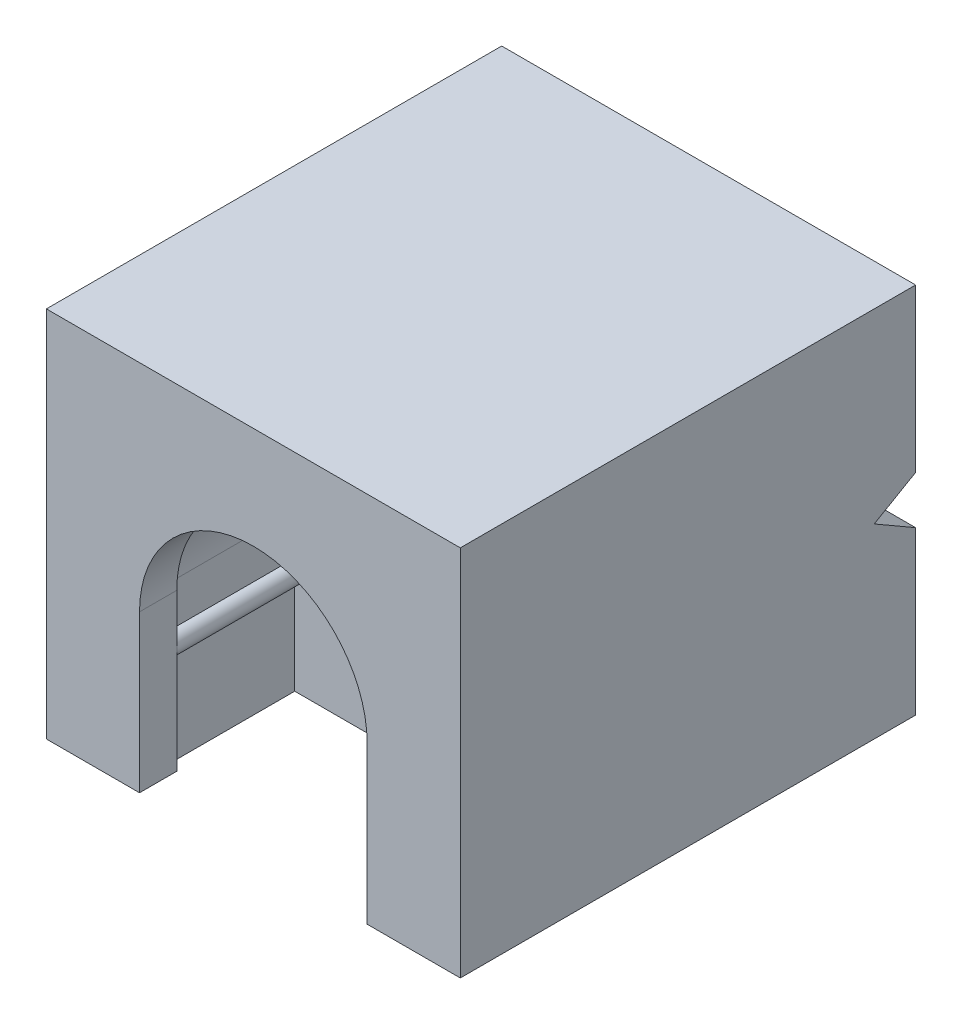
ISO-10303-21;
HEADER;
FILE_DESCRIPTION(('STEP AP214'),'2;1');
FILE_NAME('part.step','',(''),(''),'','','');
FILE_SCHEMA(('AUTOMOTIVE_DESIGN { 1 0 10303 214 1 1 1 1 }'));
ENDSEC;
DATA;
#1=APPLICATION_CONTEXT('core data for automotive mechanical design processes');
#2=APPLICATION_PROTOCOL_DEFINITION('international standard','automotive_design',2000,#1);
#3=PRODUCT_CONTEXT('',#1,'mechanical');
#4=PRODUCT('Part','Part','',(#3));
#5=PRODUCT_RELATED_PRODUCT_CATEGORY('part','',(#4));
#6=PRODUCT_DEFINITION_FORMATION('','',#4);
#7=PRODUCT_DEFINITION_CONTEXT('part definition',#1,'design');
#8=PRODUCT_DEFINITION('design','',#6,#7);
#9=PRODUCT_DEFINITION_SHAPE('','',#8);
#10=(LENGTH_UNIT() NAMED_UNIT(*) SI_UNIT(.MILLI.,.METRE.));
#11=(NAMED_UNIT(*) PLANE_ANGLE_UNIT() SI_UNIT($,.RADIAN.));
#12=(NAMED_UNIT(*) SI_UNIT($,.STERADIAN.) SOLID_ANGLE_UNIT());
#13=UNCERTAINTY_MEASURE_WITH_UNIT(LENGTH_MEASURE(1.E-05),#10,'distance_accuracy_value','');
#14=(GEOMETRIC_REPRESENTATION_CONTEXT(3) GLOBAL_UNCERTAINTY_ASSIGNED_CONTEXT((#13)) GLOBAL_UNIT_ASSIGNED_CONTEXT((#10,
#11,#12)) REPRESENTATION_CONTEXT('',''));
#15=CARTESIAN_POINT('',(0.,0.,0.));
#16=DIRECTION('',(0.,0.,1.));
#17=DIRECTION('',(1.,0.,0.));
#18=AXIS2_PLACEMENT_3D('',#15,#16,#17);
#19=CARTESIAN_POINT('',(-3.,-1.24999581003196,4.));
#20=DIRECTION('',(0.,0.,-1.));
#21=DIRECTION('',(-1.,0.,0.));
#22=AXIS2_PLACEMENT_3D('',#19,#20,#21);
#23=CYLINDRICAL_SURFACE('',#22,0.25);
#24=CARTESIAN_POINT('',(-3.,-1.24999581003196,2.85));
#25=DIRECTION('',(-0.707106781186554,0.,0.707106781186541));
#26=DIRECTION('',(-0.707106781186541,0.,-0.707106781186554));
#27=AXIS2_PLACEMENT_3D('',#24,#25,#26);
#28=ELLIPSE('',#27,0.353553390593277,0.25);
#29=CARTESIAN_POINT('',(-2.85,-1.04999581003196,3.));
#30=VERTEX_POINT('',#29);
#31=CARTESIAN_POINT('',(-2.75,-1.24999581003196,3.1));
#32=VERTEX_POINT('',#31);
#33=EDGE_CURVE('E118',#30,#32,#28,.F.);
#34=ORIENTED_EDGE('',*,*,#33,.T.);
#35=CARTESIAN_POINT('',(-3.,-1.24999581003196,2.85));
#36=DIRECTION('',(-0.707106781186554,0.,0.707106781186541));
#37=DIRECTION('',(-0.707106781186541,0.,-0.707106781186554));
#38=AXIS2_PLACEMENT_3D('',#35,#36,#37);
#39=ELLIPSE('',#38,0.353553390593277,0.25);
#40=CARTESIAN_POINT('',(-2.85,-1.44999581003196,3.));
#41=VERTEX_POINT('',#40);
#42=EDGE_CURVE('E12',#32,#41,#39,.F.);
#43=ORIENTED_EDGE('',*,*,#42,.T.);
#44=CARTESIAN_POINT('',(-3.,-1.24999581003196,3.));
#45=DIRECTION('',(0.,0.,1.));
#46=DIRECTION('',(1.,0.,0.));
#47=AXIS2_PLACEMENT_3D('',#44,#45,#46);
#48=CIRCLE('',#47,0.25);
#49=CARTESIAN_POINT('',(-3.,-1.49999581003196,3.));
#50=VERTEX_POINT('',#49);
#51=EDGE_CURVE('E482',#50,#41,#48,.T.);
#52=ORIENTED_EDGE('',*,*,#51,.F.);
#53=DIRECTION('',(0.,0.,-1.));
#54=VECTOR('',#53,1.);
#55=CARTESIAN_POINT('',(-3.,-1.49999581003196,4.));
#56=LINE('',#55,#54);
#57=CARTESIAN_POINT('',(-3.,-1.49999581003196,0.));
#58=VERTEX_POINT('',#57);
#59=EDGE_CURVE('E411',#50,#58,#56,.T.);
#60=ORIENTED_EDGE('',*,*,#59,.T.);
#61=CARTESIAN_POINT('',(-3.,-1.24999581003196,0.));
#62=DIRECTION('',(0.,0.,1.));
#63=DIRECTION('',(1.,0.,0.));
#64=AXIS2_PLACEMENT_3D('',#61,#62,#63);
#65=CIRCLE('',#64,0.25);
#66=CARTESIAN_POINT('',(-3.,-0.999995810031962,0.));
#67=VERTEX_POINT('',#66);
#68=EDGE_CURVE('E398',#67,#58,#65,.F.);
#69=ORIENTED_EDGE('',*,*,#68,.F.);
#70=DIRECTION('',(0.,0.,-1.));
#71=VECTOR('',#70,1.);
#72=CARTESIAN_POINT('',(-3.,-0.999995810031962,4.));
#73=LINE('',#72,#71);
#74=CARTESIAN_POINT('',(-3.,-0.999995810031962,3.));
#75=VERTEX_POINT('',#74);
#76=EDGE_CURVE('E409',#75,#67,#73,.T.);
#77=ORIENTED_EDGE('',*,*,#76,.F.);
#78=CARTESIAN_POINT('',(-3.,-1.24999581003196,3.));
#79=DIRECTION('',(0.,0.,1.));
#80=DIRECTION('',(1.,0.,0.));
#81=AXIS2_PLACEMENT_3D('',#78,#79,#80);
#82=CIRCLE('',#81,0.25);
#83=EDGE_CURVE('E325',#30,#75,#82,.T.);
#84=ORIENTED_EDGE('',*,*,#83,.F.);
#85=EDGE_LOOP('',(#34,#43,#52,#60,#69,#77,#84));
#86=FACE_BOUND('',#85,.T.);
#87=ADVANCED_FACE('F109',(#86),#23,.T.);
#88=CARTESIAN_POINT('',(-3.,0.,4.));
#89=DIRECTION('',(1.,0.,0.));
#90=DIRECTION('',(0.,0.,-1.));
#91=AXIS2_PLACEMENT_3D('',#88,#89,#90);
#92=PLANE('',#91);
#93=ORIENTED_EDGE('',*,*,#59,.F.);
#94=DIRECTION('',(0.,1.,0.));
#95=VECTOR('',#94,1.);
#96=CARTESIAN_POINT('',(-3.,0.,3.));
#97=LINE('',#96,#95);
#98=CARTESIAN_POINT('',(-3.,-3.78606083848625,3.));
#99=VERTEX_POINT('',#98);
#100=EDGE_CURVE('E298',#99,#50,#97,.T.);
#101=ORIENTED_EDGE('',*,*,#100,.F.);
#102=DIRECTION('',(0.,0.,-1.));
#103=VECTOR('',#102,1.);
#104=CARTESIAN_POINT('',(-3.,-3.78606083848625,4.));
#105=LINE('',#104,#103);
#106=CARTESIAN_POINT('',(-3.,-3.78606083848625,0.));
#107=VERTEX_POINT('',#106);
#108=EDGE_CURVE('E413',#99,#107,#105,.T.);
#109=ORIENTED_EDGE('',*,*,#108,.T.);
#110=DIRECTION('',(0.,-1.,0.));
#111=VECTOR('',#110,1.);
#112=CARTESIAN_POINT('',(-3.,0.,0.));
#113=LINE('',#112,#111);
#114=EDGE_CURVE('E395',#58,#107,#113,.T.);
#115=ORIENTED_EDGE('',*,*,#114,.F.);
#116=EDGE_LOOP('',(#93,#101,#109,#115));
#117=FACE_BOUND('',#116,.T.);
#118=ADVANCED_FACE('F514',(#117),#92,.T.);
#119=CARTESIAN_POINT('',(3.,-1.24999581003196,4.));
#120=DIRECTION('',(0.,0.,-1.));
#121=DIRECTION('',(-1.,0.,0.));
#122=AXIS2_PLACEMENT_3D('',#119,#120,#121);
#123=CYLINDRICAL_SURFACE('',#122,0.25);
#124=CARTESIAN_POINT('',(3.,-1.24999581003196,2.85000000000001));
#125=DIRECTION('',(-0.707106781186541,0.,-0.707106781186554));
#126=DIRECTION('',(0.707106781186554,0.,-0.707106781186541));
#127=AXIS2_PLACEMENT_3D('',#124,#125,#126);
#128=ELLIPSE('',#127,0.353553390593271,0.25);
#129=CARTESIAN_POINT('',(2.85,-1.44999581003196,3.));
#130=VERTEX_POINT('',#129);
#131=CARTESIAN_POINT('',(2.75,-1.24999581003196,3.1));
#132=VERTEX_POINT('',#131);
#133=EDGE_CURVE('E461',#130,#132,#128,.T.);
#134=ORIENTED_EDGE('',*,*,#133,.T.);
#135=CARTESIAN_POINT('',(3.,-1.24999581003196,2.85));
#136=DIRECTION('',(-0.707106781186554,0.,-0.707106781186541));
#137=DIRECTION('',(0.707106781186541,0.,-0.707106781186554));
#138=AXIS2_PLACEMENT_3D('',#135,#136,#137);
#139=ELLIPSE('',#138,0.353553390593277,0.25);
#140=CARTESIAN_POINT('',(2.85,-1.04999581003196,3.));
#141=VERTEX_POINT('',#140);
#142=EDGE_CURVE('E464',#132,#141,#139,.T.);
#143=ORIENTED_EDGE('',*,*,#142,.T.);
#144=CARTESIAN_POINT('',(3.,-1.24999581003196,3.));
#145=DIRECTION('',(0.,0.,1.));
#146=DIRECTION('',(1.,0.,0.));
#147=AXIS2_PLACEMENT_3D('',#144,#145,#146);
#148=CIRCLE('',#147,0.25);
#149=CARTESIAN_POINT('',(3.,-0.999995810031962,3.));
#150=VERTEX_POINT('',#149);
#151=EDGE_CURVE('E330',#150,#141,#148,.T.);
#152=ORIENTED_EDGE('',*,*,#151,.F.);
#153=DIRECTION('',(0.,0.,-1.));
#154=VECTOR('',#153,1.);
#155=CARTESIAN_POINT('',(3.,-0.999995810031962,4.));
#156=LINE('',#155,#154);
#157=CARTESIAN_POINT('',(3.,-0.999995810031962,0.));
#158=VERTEX_POINT('',#157);
#159=EDGE_CURVE('E428',#150,#158,#156,.T.);
#160=ORIENTED_EDGE('',*,*,#159,.T.);
#161=CARTESIAN_POINT('',(3.,-1.24999581003196,0.));
#162=DIRECTION('',(0.,0.,1.));
#163=DIRECTION('',(1.,0.,0.));
#164=AXIS2_PLACEMENT_3D('',#161,#162,#163);
#165=CIRCLE('',#164,0.25);
#166=CARTESIAN_POINT('',(3.,-1.49999581003196,0.));
#167=VERTEX_POINT('',#166);
#168=EDGE_CURVE('E389',#158,#167,#165,.T.);
#169=ORIENTED_EDGE('',*,*,#168,.T.);
#170=DIRECTION('',(0.,0.,-1.));
#171=VECTOR('',#170,1.);
#172=CARTESIAN_POINT('',(3.,-1.49999581003196,4.));
#173=LINE('',#172,#171);
#174=CARTESIAN_POINT('',(3.,-1.49999581003196,3.));
#175=VERTEX_POINT('',#174);
#176=EDGE_CURVE('E426',#175,#167,#173,.T.);
#177=ORIENTED_EDGE('',*,*,#176,.F.);
#178=CARTESIAN_POINT('',(3.,-1.24999581003196,3.));
#179=DIRECTION('',(0.,0.,1.));
#180=DIRECTION('',(1.,0.,0.));
#181=AXIS2_PLACEMENT_3D('',#178,#179,#180);
#182=CIRCLE('',#181,0.25);
#183=EDGE_CURVE('E322',#130,#175,#182,.T.);
#184=ORIENTED_EDGE('',*,*,#183,.F.);
#185=EDGE_LOOP('',(#134,#143,#152,#160,#169,#177,#184));
#186=FACE_BOUND('',#185,.T.);
#187=ADVANCED_FACE('F583',(#186),#123,.T.);
#188=CARTESIAN_POINT('',(3.,0.,4.));
#189=DIRECTION('',(1.,0.,0.));
#190=DIRECTION('',(0.,0.,-1.));
#191=AXIS2_PLACEMENT_3D('',#188,#189,#190);
#192=PLANE('',#191);
#193=DIRECTION('',(0.,-1.,0.));
#194=VECTOR('',#193,1.);
#195=CARTESIAN_POINT('',(3.,0.,3.));
#196=LINE('',#195,#194);
#197=CARTESIAN_POINT('',(3.,-3.78606083848625,3.));
#198=VERTEX_POINT('',#197);
#199=EDGE_CURVE('E317',#175,#198,#196,.T.);
#200=ORIENTED_EDGE('',*,*,#199,.F.);
#201=ORIENTED_EDGE('',*,*,#176,.T.);
#202=DIRECTION('',(0.,-1.,0.));
#203=VECTOR('',#202,1.);
#204=CARTESIAN_POINT('',(3.,0.,0.));
#205=LINE('',#204,#203);
#206=CARTESIAN_POINT('',(3.,-3.78606083848625,0.));
#207=VERTEX_POINT('',#206);
#208=EDGE_CURVE('E392',#167,#207,#205,.T.);
#209=ORIENTED_EDGE('',*,*,#208,.T.);
#210=DIRECTION('',(0.,0.,-1.));
#211=VECTOR('',#210,1.);
#212=CARTESIAN_POINT('',(3.,-3.78606083848625,4.));
#213=LINE('',#212,#211);
#214=EDGE_CURVE('E424',#198,#207,#213,.T.);
#215=ORIENTED_EDGE('',*,*,#214,.F.);
#216=EDGE_LOOP('',(#200,#201,#209,#215));
#217=FACE_BOUND('',#216,.T.);
#218=ADVANCED_FACE('F630',(#217),#192,.F.);
#219=CARTESIAN_POINT('',(3.,0.,4.));
#220=DIRECTION('',(-1.,0.,0.));
#221=DIRECTION('',(0.,-1.,0.));
#222=AXIS2_PLACEMENT_3D('',#219,#220,#221);
#223=PLANE('',#222);
#224=ORIENTED_EDGE('',*,*,#159,.F.);
#225=DIRECTION('',(0.,-1.,0.));
#226=VECTOR('',#225,1.);
#227=CARTESIAN_POINT('',(3.,0.,3.));
#228=LINE('',#227,#226);
#229=CARTESIAN_POINT('',(3.,0.,3.));
#230=VERTEX_POINT('',#229);
#231=EDGE_CURVE('E491',#230,#150,#228,.T.);
#232=ORIENTED_EDGE('',*,*,#231,.F.);
#233=DIRECTION('',(0.,0.,-1.));
#234=VECTOR('',#233,1.);
#235=CARTESIAN_POINT('',(3.,0.,4.));
#236=LINE('',#235,#234);
#237=CARTESIAN_POINT('',(3.,0.,0.));
#238=VERTEX_POINT('',#237);
#239=EDGE_CURVE('E311',#230,#238,#236,.T.);
#240=ORIENTED_EDGE('',*,*,#239,.T.);
#241=DIRECTION('',(0.,1.,0.));
#242=VECTOR('',#241,1.);
#243=CARTESIAN_POINT('',(3.,0.,0.));
#244=LINE('',#243,#242);
#245=EDGE_CURVE('E375',#158,#238,#244,.T.);
#246=ORIENTED_EDGE('',*,*,#245,.F.);
#247=EDGE_LOOP('',(#224,#232,#240,#246));
#248=FACE_BOUND('',#247,.T.);
#249=ADVANCED_FACE('F605',(#248),#223,.T.);
#250=CARTESIAN_POINT('',(-3.,0.,4.));
#251=DIRECTION('',(-1.,0.,0.));
#252=DIRECTION('',(0.,-1.,0.));
#253=AXIS2_PLACEMENT_3D('',#250,#251,#252);
#254=PLANE('',#253);
#255=DIRECTION('',(0.,1.,0.));
#256=VECTOR('',#255,1.);
#257=CARTESIAN_POINT('',(-3.,0.,3.));
#258=LINE('',#257,#256);
#259=CARTESIAN_POINT('',(-3.,0.,3.));
#260=VERTEX_POINT('',#259);
#261=EDGE_CURVE('E494',#75,#260,#258,.T.);
#262=ORIENTED_EDGE('',*,*,#261,.F.);
#263=ORIENTED_EDGE('',*,*,#76,.T.);
#264=DIRECTION('',(0.,1.,0.));
#265=VECTOR('',#264,1.);
#266=CARTESIAN_POINT('',(-3.,0.,0.));
#267=LINE('',#266,#265);
#268=CARTESIAN_POINT('',(-3.,0.,0.));
#269=VERTEX_POINT('',#268);
#270=EDGE_CURVE('E401',#67,#269,#267,.T.);
#271=ORIENTED_EDGE('',*,*,#270,.T.);
#272=DIRECTION('',(0.,0.,-1.));
#273=VECTOR('',#272,1.);
#274=CARTESIAN_POINT('',(-3.,0.,4.));
#275=LINE('',#274,#273);
#276=EDGE_CURVE('E407',#260,#269,#275,.T.);
#277=ORIENTED_EDGE('',*,*,#276,.F.);
#278=EDGE_LOOP('',(#262,#263,#271,#277));
#279=FACE_BOUND('',#278,.T.);
#280=ADVANCED_FACE('F505',(#279),#254,.F.);
#281=CARTESIAN_POINT('',(0.,0.,4.));
#282=DIRECTION('',(0.,0.,-1.));
#283=DIRECTION('',(-1.,0.,0.));
#284=AXIS2_PLACEMENT_3D('',#281,#282,#283);
#285=CYLINDRICAL_SURFACE('',#284,3.);
#286=ORIENTED_EDGE('',*,*,#239,.F.);
#287=CARTESIAN_POINT('',(0.,0.,3.));
#288=DIRECTION('',(0.,0.,1.));
#289=DIRECTION('',(1.,0.,0.));
#290=AXIS2_PLACEMENT_3D('',#287,#288,#289);
#291=CIRCLE('',#290,3.);
#292=EDGE_CURVE('E493',#260,#230,#291,.F.);
#293=ORIENTED_EDGE('',*,*,#292,.F.);
#294=ORIENTED_EDGE('',*,*,#276,.T.);
#295=CARTESIAN_POINT('',(0.,0.,0.));
#296=DIRECTION('',(0.,0.,1.));
#297=DIRECTION('',(1.,0.,0.));
#298=AXIS2_PLACEMENT_3D('',#295,#296,#297);
#299=CIRCLE('',#298,3.);
#300=EDGE_CURVE('E381',#238,#269,#299,.T.);
#301=ORIENTED_EDGE('',*,*,#300,.F.);
#302=EDGE_LOOP('',(#286,#293,#294,#301));
#303=FACE_BOUND('',#302,.T.);
#304=ADVANCED_FACE('F598',(#303),#285,.F.);
#305=CARTESIAN_POINT('',(0.,0.,-7.));
#306=DIRECTION('',(0.,0.,-1.));
#307=DIRECTION('',(-1.,0.,0.));
#308=AXIS2_PLACEMENT_3D('',#305,#306,#307);
#309=PLANE('',#308);
#310=DIRECTION('',(1.,0.,0.));
#311=VECTOR('',#310,1.);
#312=CARTESIAN_POINT('',(0.,1.29128943070337,-7.));
#313=LINE('',#312,#311);
#314=CARTESIAN_POINT('',(-5.,1.29128943070337,-7.));
#315=VERTEX_POINT('',#314);
#316=CARTESIAN_POINT('',(-0.47871355387817,1.29128943070337,-7.));
#317=VERTEX_POINT('',#316);
#318=EDGE_CURVE('E352',#315,#317,#313,.T.);
#319=ORIENTED_EDGE('',*,*,#318,.F.);
#320=DIRECTION('',(0.,-1.,0.));
#321=VECTOR('',#320,1.);
#322=CARTESIAN_POINT('',(-5.,5.21393916151375,-7.));
#323=LINE('',#322,#321);
#324=CARTESIAN_POINT('',(-5.,5.21393916151375,-7.));
#325=VERTEX_POINT('',#324);
#326=EDGE_CURVE('E369',#325,#315,#323,.T.);
#327=ORIENTED_EDGE('',*,*,#326,.F.);
#328=DIRECTION('',(-1.,0.,0.));
#329=VECTOR('',#328,1.);
#330=CARTESIAN_POINT('',(5.,5.21393916151375,-7.));
#331=LINE('',#330,#329);
#332=CARTESIAN_POINT('',(5.,5.21393916151375,-7.));
#333=VERTEX_POINT('',#332);
#334=EDGE_CURVE('E364',#333,#325,#331,.T.);
#335=ORIENTED_EDGE('',*,*,#334,.F.);
#336=DIRECTION('',(0.,1.,0.));
#337=VECTOR('',#336,1.);
#338=CARTESIAN_POINT('',(5.,5.21393916151375,-7.));
#339=LINE('',#338,#337);
#340=CARTESIAN_POINT('',(5.,1.29128943070337,-7.));
#341=VERTEX_POINT('',#340);
#342=EDGE_CURVE('E365',#341,#333,#339,.T.);
#343=ORIENTED_EDGE('',*,*,#342,.F.);
#344=CARTESIAN_POINT('',(0.478713553878169,1.29128943070337,-7.));
#345=VERTEX_POINT('',#344);
#346=EDGE_CURVE('E350',#345,#341,#313,.T.);
#347=ORIENTED_EDGE('',*,*,#346,.F.);
#348=CARTESIAN_POINT('',(0.,0.713939161513746,-7.));
#349=DIRECTION('',(0.,0.,-1.));
#350=DIRECTION('',(-1.,0.,0.));
#351=AXIS2_PLACEMENT_3D('',#348,#349,#350);
#352=CIRCLE('',#351,0.75);
#353=EDGE_CURVE('E357',#317,#345,#352,.T.);
#354=ORIENTED_EDGE('',*,*,#353,.F.);
#355=EDGE_LOOP('',(#319,#327,#335,#343,#347,#354));
#356=FACE_BOUND('',#355,.T.);
#357=ADVANCED_FACE('F567',(#356),#309,.T.);
#358=CARTESIAN_POINT('',(5.,0.,4.));
#359=DIRECTION('',(-1.,0.,0.));
#360=DIRECTION('',(0.,0.,1.));
#361=AXIS2_PLACEMENT_3D('',#358,#359,#360);
#362=PLANE('',#361);
#363=DIRECTION('',(0.,-0.500000000000001,-0.866025403784438));
#364=VECTOR('',#363,1.);
#365=CARTESIAN_POINT('',(5.,0.713939161513747,-6.));
#366=LINE('',#365,#364);
#367=CARTESIAN_POINT('',(5.,0.713939161513747,-6.));
#368=VERTEX_POINT('',#367);
#369=CARTESIAN_POINT('',(5.,0.136588892324119,-7.));
#370=VERTEX_POINT('',#369);
#371=EDGE_CURVE('E333',#368,#370,#366,.T.);
#372=ORIENTED_EDGE('',*,*,#371,.F.);
#373=DIRECTION('',(0.,-0.499999999999999,0.866025403784439));
#374=VECTOR('',#373,1.);
#375=CARTESIAN_POINT('',(5.,1.57996456529819,-7.5));
#376=LINE('',#375,#374);
#377=EDGE_CURVE('E335',#341,#368,#376,.T.);
#378=ORIENTED_EDGE('',*,*,#377,.F.);
#379=ORIENTED_EDGE('',*,*,#342,.T.);
#380=DIRECTION('',(0.,0.,-1.));
#381=VECTOR('',#380,1.);
#382=CARTESIAN_POINT('',(5.,5.21393916151375,4.));
#383=LINE('',#382,#381);
#384=CARTESIAN_POINT('',(5.,5.21393916151375,4.));
#385=VERTEX_POINT('',#384);
#386=EDGE_CURVE('E419',#385,#333,#383,.T.);
#387=ORIENTED_EDGE('',*,*,#386,.F.);
#388=DIRECTION('',(0.,1.,0.));
#389=VECTOR('',#388,1.);
#390=CARTESIAN_POINT('',(5.,0.,4.));
#391=LINE('',#390,#389);
#392=CARTESIAN_POINT('',(5.,-3.78606083848625,4.));
#393=VERTEX_POINT('',#392);
#394=EDGE_CURVE('E380',#393,#385,#391,.T.);
#395=ORIENTED_EDGE('',*,*,#394,.F.);
#396=DIRECTION('',(0.,0.,-1.));
#397=VECTOR('',#396,1.);
#398=CARTESIAN_POINT('',(5.,-3.78606083848625,4.));
#399=LINE('',#398,#397);
#400=CARTESIAN_POINT('',(5.,-3.78606083848625,-7.));
#401=VERTEX_POINT('',#400);
#402=EDGE_CURVE('E422',#393,#401,#399,.T.);
#403=ORIENTED_EDGE('',*,*,#402,.T.);
#404=EDGE_CURVE('E361',#401,#370,#339,.T.);
#405=ORIENTED_EDGE('',*,*,#404,.T.);
#406=EDGE_LOOP('',(#372,#378,#379,#387,#395,#403,#405));
#407=FACE_BOUND('',#406,.T.);
#408=ADVANCED_FACE('F538',(#407),#362,.F.);
#409=CARTESIAN_POINT('',(0.,5.21393916151375,4.));
#410=DIRECTION('',(0.,1.,0.));
#411=DIRECTION('',(0.,0.,1.));
#412=AXIS2_PLACEMENT_3D('',#409,#410,#411);
#413=PLANE('',#412);
#414=ORIENTED_EDGE('',*,*,#386,.T.);
#415=ORIENTED_EDGE('',*,*,#334,.T.);
#416=DIRECTION('',(0.,0.,-1.));
#417=VECTOR('',#416,1.);
#418=CARTESIAN_POINT('',(-5.,5.21393916151375,4.));
#419=LINE('',#418,#417);
#420=CARTESIAN_POINT('',(-5.,5.21393916151375,4.));
#421=VERTEX_POINT('',#420);
#422=EDGE_CURVE('E417',#421,#325,#419,.T.);
#423=ORIENTED_EDGE('',*,*,#422,.F.);
#424=DIRECTION('',(1.,0.,0.));
#425=VECTOR('',#424,1.);
#426=CARTESIAN_POINT('',(0.,5.21393916151375,4.));
#427=LINE('',#426,#425);
#428=EDGE_CURVE('E383',#421,#385,#427,.T.);
#429=ORIENTED_EDGE('',*,*,#428,.T.);
#430=EDGE_LOOP('',(#414,#415,#423,#429));
#431=FACE_BOUND('',#430,.T.);
#432=ADVANCED_FACE('F569',(#431),#413,.T.);
#433=CARTESIAN_POINT('',(-5.,0.,4.));
#434=DIRECTION('',(-1.,0.,0.));
#435=DIRECTION('',(0.,0.,1.));
#436=AXIS2_PLACEMENT_3D('',#433,#434,#435);
#437=PLANE('',#436);
#438=DIRECTION('',(0.,-0.499999999999999,0.866025403784439));
#439=VECTOR('',#438,1.);
#440=CARTESIAN_POINT('',(-5.,1.57996456529819,-7.5));
#441=LINE('',#440,#439);
#442=CARTESIAN_POINT('',(-5.,0.713939161513747,-6.));
#443=VERTEX_POINT('',#442);
#444=EDGE_CURVE('E337',#315,#443,#441,.T.);
#445=ORIENTED_EDGE('',*,*,#444,.T.);
#446=DIRECTION('',(0.,-0.500000000000001,-0.866025403784438));
#447=VECTOR('',#446,1.);
#448=CARTESIAN_POINT('',(-5.,0.713939161513747,-6.));
#449=LINE('',#448,#447);
#450=CARTESIAN_POINT('',(-5.,0.136588892324119,-7.));
#451=VERTEX_POINT('',#450);
#452=EDGE_CURVE('E339',#443,#451,#449,.T.);
#453=ORIENTED_EDGE('',*,*,#452,.T.);
#454=CARTESIAN_POINT('',(-5.,-3.78606083848625,-7.));
#455=VERTEX_POINT('',#454);
#456=EDGE_CURVE('E368',#451,#455,#323,.T.);
#457=ORIENTED_EDGE('',*,*,#456,.T.);
#458=DIRECTION('',(0.,0.,-1.));
#459=VECTOR('',#458,1.);
#460=CARTESIAN_POINT('',(-5.,-3.78606083848625,4.));
#461=LINE('',#460,#459);
#462=CARTESIAN_POINT('',(-5.,-3.78606083848625,4.));
#463=VERTEX_POINT('',#462);
#464=EDGE_CURVE('E415',#463,#455,#461,.T.);
#465=ORIENTED_EDGE('',*,*,#464,.F.);
#466=DIRECTION('',(0.,1.,0.));
#467=VECTOR('',#466,1.);
#468=CARTESIAN_POINT('',(-5.,0.,4.));
#469=LINE('',#468,#467);
#470=EDGE_CURVE('E310',#463,#421,#469,.T.);
#471=ORIENTED_EDGE('',*,*,#470,.T.);
#472=ORIENTED_EDGE('',*,*,#422,.T.);
#473=ORIENTED_EDGE('',*,*,#326,.T.);
#474=EDGE_LOOP('',(#445,#453,#457,#465,#471,#472,#473));
#475=FACE_BOUND('',#474,.T.);
#476=ADVANCED_FACE('F541',(#475),#437,.T.);
#477=CARTESIAN_POINT('',(0.,-3.78606083848625,4.));
#478=DIRECTION('',(0.,-1.,0.));
#479=DIRECTION('',(0.,0.,-1.));
#480=AXIS2_PLACEMENT_3D('',#477,#478,#479);
#481=PLANE('',#480);
#482=DIRECTION('',(0.,0.,1.));
#483=VECTOR('',#482,1.);
#484=CARTESIAN_POINT('',(2.75,-3.78606083848625,3.));
#485=LINE('',#484,#483);
#486=CARTESIAN_POINT('',(2.75,-3.78606083848625,3.1));
#487=VERTEX_POINT('',#486);
#488=CARTESIAN_POINT('',(2.75,-3.78606083848625,4.));
#489=VERTEX_POINT('',#488);
#490=EDGE_CURVE('E483',#487,#489,#485,.T.);
#491=ORIENTED_EDGE('',*,*,#490,.F.);
#492=DIRECTION('',(0.707106781186554,0.,-0.707106781186541));
#493=VECTOR('',#492,1.);
#494=CARTESIAN_POINT('',(0.924999999999977,-3.78606083848625,4.92499999999999));
#495=LINE('',#494,#493);
#496=CARTESIAN_POINT('',(2.85,-3.78606083848625,3.));
#497=VERTEX_POINT('',#496);
#498=EDGE_CURVE('E444',#487,#497,#495,.T.);
#499=ORIENTED_EDGE('',*,*,#498,.T.);
#500=DIRECTION('',(1.,0.,0.));
#501=VECTOR('',#500,1.);
#502=CARTESIAN_POINT('',(0.,-3.78606083848624,3.));
#503=LINE('',#502,#501);
#504=EDGE_CURVE('E485',#497,#198,#503,.T.);
#505=ORIENTED_EDGE('',*,*,#504,.T.);
#506=ORIENTED_EDGE('',*,*,#214,.T.);
#507=DIRECTION('',(1.,0.,0.));
#508=VECTOR('',#507,1.);
#509=CARTESIAN_POINT('',(5.,-3.78606083848625,0.));
#510=LINE('',#509,#508);
#511=EDGE_CURVE('E356',#107,#207,#510,.T.);
#512=ORIENTED_EDGE('',*,*,#511,.F.);
#513=ORIENTED_EDGE('',*,*,#108,.F.);
#514=DIRECTION('',(1.,0.,0.));
#515=VECTOR('',#514,1.);
#516=CARTESIAN_POINT('',(0.,-3.78606083848625,3.));
#517=LINE('',#516,#515);
#518=CARTESIAN_POINT('',(-2.85,-3.78606083848625,3.));
#519=VERTEX_POINT('',#518);
#520=EDGE_CURVE('E299',#99,#519,#517,.T.);
#521=ORIENTED_EDGE('',*,*,#520,.T.);
#522=DIRECTION('',(-0.707106781186541,0.,-0.707106781186554));
#523=VECTOR('',#522,1.);
#524=CARTESIAN_POINT('',(-0.925000000000025,-3.78606083848625,4.92500000000001));
#525=LINE('',#524,#523);
#526=CARTESIAN_POINT('',(-2.75,-3.78606083848625,3.1));
#527=VERTEX_POINT('',#526);
#528=EDGE_CURVE('E296',#519,#527,#525,.F.);
#529=ORIENTED_EDGE('',*,*,#528,.T.);
#530=DIRECTION('',(0.,0.,1.));
#531=VECTOR('',#530,1.);
#532=CARTESIAN_POINT('',(-2.75,-3.78606083848625,3.));
#533=LINE('',#532,#531);
#534=CARTESIAN_POINT('',(-2.75,-3.78606083848625,4.));
#535=VERTEX_POINT('',#534);
#536=EDGE_CURVE('E288',#527,#535,#533,.T.);
#537=ORIENTED_EDGE('',*,*,#536,.T.);
#538=DIRECTION('',(-1.,0.,0.));
#539=VECTOR('',#538,1.);
#540=CARTESIAN_POINT('',(0.,-3.78606083848625,4.));
#541=LINE('',#540,#539);
#542=EDGE_CURVE('E293',#535,#463,#541,.T.);
#543=ORIENTED_EDGE('',*,*,#542,.T.);
#544=ORIENTED_EDGE('',*,*,#464,.T.);
#545=DIRECTION('',(1.,0.,0.));
#546=VECTOR('',#545,1.);
#547=CARTESIAN_POINT('',(5.,-3.78606083848625,-7.));
#548=LINE('',#547,#546);
#549=EDGE_CURVE('E372',#455,#401,#548,.T.);
#550=ORIENTED_EDGE('',*,*,#549,.T.);
#551=ORIENTED_EDGE('',*,*,#402,.F.);
#552=DIRECTION('',(1.,0.,0.));
#553=VECTOR('',#552,1.);
#554=CARTESIAN_POINT('',(0.,-3.78606083848625,4.));
#555=LINE('',#554,#553);
#556=EDGE_CURVE('E378',#489,#393,#555,.T.);
#557=ORIENTED_EDGE('',*,*,#556,.F.);
#558=EDGE_LOOP('',(#491,#499,#505,#506,#512,#513,#521,#529,#537,#543,#544,#550,#551,#557));
#559=FACE_BOUND('',#558,.T.);
#560=ADVANCED_FACE('F291',(#559),#481,.T.);
#561=CARTESIAN_POINT('',(0.,0.,4.));
#562=DIRECTION('',(0.,0.,1.));
#563=DIRECTION('',(1.,0.,0.));
#564=AXIS2_PLACEMENT_3D('',#561,#562,#563);
#565=PLANE('',#564);
#566=ORIENTED_EDGE('',*,*,#542,.F.);
#567=DIRECTION('',(0.,-1.,0.));
#568=VECTOR('',#567,1.);
#569=CARTESIAN_POINT('',(-2.75,0.,4.));
#570=LINE('',#569,#568);
#571=CARTESIAN_POINT('',(-2.75,0.,4.));
#572=VERTEX_POINT('',#571);
#573=EDGE_CURVE('E306',#572,#535,#570,.T.);
#574=ORIENTED_EDGE('',*,*,#573,.F.);
#575=CARTESIAN_POINT('',(0.,0.,4.));
#576=DIRECTION('',(0.,0.,1.));
#577=DIRECTION('',(1.,0.,0.));
#578=AXIS2_PLACEMENT_3D('',#575,#576,#577);
#579=CIRCLE('',#578,2.75);
#580=CARTESIAN_POINT('',(2.75,0.,4.));
#581=VERTEX_POINT('',#580);
#582=EDGE_CURVE('E316',#572,#581,#579,.F.);
#583=ORIENTED_EDGE('',*,*,#582,.T.);
#584=DIRECTION('',(0.,-1.,0.));
#585=VECTOR('',#584,1.);
#586=CARTESIAN_POINT('',(2.75,0.,4.));
#587=LINE('',#586,#585);
#588=EDGE_CURVE('E319',#581,#489,#587,.T.);
#589=ORIENTED_EDGE('',*,*,#588,.T.);
#590=ORIENTED_EDGE('',*,*,#556,.T.);
#591=ORIENTED_EDGE('',*,*,#394,.T.);
#592=ORIENTED_EDGE('',*,*,#428,.F.);
#593=ORIENTED_EDGE('',*,*,#470,.F.);
#594=EDGE_LOOP('',(#566,#574,#583,#589,#590,#591,#592,#593));
#595=FACE_BOUND('',#594,.T.);
#596=ADVANCED_FACE('F304',(#595),#565,.T.);
#597=CARTESIAN_POINT('',(0.,0.,0.));
#598=DIRECTION('',(0.,0.,-1.));
#599=DIRECTION('',(-1.,0.,0.));
#600=AXIS2_PLACEMENT_3D('',#597,#598,#599);
#601=PLANE('',#600);
#602=ORIENTED_EDGE('',*,*,#68,.T.);
#603=ORIENTED_EDGE('',*,*,#114,.T.);
#604=ORIENTED_EDGE('',*,*,#511,.T.);
#605=ORIENTED_EDGE('',*,*,#208,.F.);
#606=ORIENTED_EDGE('',*,*,#168,.F.);
#607=ORIENTED_EDGE('',*,*,#245,.T.);
#608=ORIENTED_EDGE('',*,*,#300,.T.);
#609=ORIENTED_EDGE('',*,*,#270,.F.);
#610=EDGE_LOOP('',(#602,#603,#604,#605,#606,#607,#608,#609));
#611=FACE_BOUND('',#610,.T.);
#612=ADVANCED_FACE('F511',(#611),#601,.F.);
#613=DIRECTION('',(-1.,0.,0.));
#614=VECTOR('',#613,1.);
#615=CARTESIAN_POINT('',(0.,0.136588892324119,-7.));
#616=LINE('',#615,#614);
#617=CARTESIAN_POINT('',(0.478713553878168,0.13658889232412,-7.));
#618=VERTEX_POINT('',#617);
#619=EDGE_CURVE('E349',#370,#618,#616,.T.);
#620=ORIENTED_EDGE('',*,*,#619,.F.);
#621=ORIENTED_EDGE('',*,*,#404,.F.);
#622=ORIENTED_EDGE('',*,*,#549,.F.);
#623=ORIENTED_EDGE('',*,*,#456,.F.);
#624=CARTESIAN_POINT('',(-0.478713553878169,0.13658889232412,-7.));
#625=VERTEX_POINT('',#624);
#626=EDGE_CURVE('E342',#625,#451,#616,.T.);
#627=ORIENTED_EDGE('',*,*,#626,.F.);
#628=EDGE_CURVE('E360',#618,#625,#352,.T.);
#629=ORIENTED_EDGE('',*,*,#628,.F.);
#630=EDGE_LOOP('',(#620,#621,#622,#623,#627,#629));
#631=FACE_BOUND('',#630,.T.);
#632=ADVANCED_FACE('F546',(#631),#309,.T.);
#633=CARTESIAN_POINT('',(0.,0.713939161513746,-1.));
#634=DIRECTION('',(0.,0.,-1.));
#635=DIRECTION('',(-1.,0.,0.));
#636=AXIS2_PLACEMENT_3D('',#633,#634,#635);
#637=CYLINDRICAL_SURFACE('',#636,0.75);
#638=CARTESIAN_POINT('',(0.,0.713939161513746,-1.));
#639=DIRECTION('',(0.,0.,-1.));
#640=DIRECTION('',(-1.,0.,0.));
#641=AXIS2_PLACEMENT_3D('',#638,#639,#640);
#642=CIRCLE('',#641,0.75);
#643=CARTESIAN_POINT('',(-0.75,0.713939161513746,-1.));
#644=VERTEX_POINT('',#643);
#645=EDGE_CURVE('E353',#644,#644,#642,.T.);
#646=ORIENTED_EDGE('',*,*,#645,.F.);
#647=EDGE_LOOP('',(#646));
#648=FACE_BOUND('',#647,.T.);
#649=ORIENTED_EDGE('',*,*,#353,.T.);
#650=CARTESIAN_POINT('',(0.,0.713939161513746,-6.));
#651=DIRECTION('',(0.,0.866025403784439,0.499999999999999));
#652=DIRECTION('',(0.,0.499999999999999,-0.866025403784439));
#653=AXIS2_PLACEMENT_3D('',#650,#651,#652);
#654=ELLIPSE('',#653,1.5,0.75);
#655=CARTESIAN_POINT('',(0.75,0.713939161513747,-6.));
#656=VERTEX_POINT('',#655);
#657=EDGE_CURVE('E437',#345,#656,#654,.F.);
#658=ORIENTED_EDGE('',*,*,#657,.T.);
#659=CARTESIAN_POINT('',(0.,0.713939161513746,-6.));
#660=DIRECTION('',(0.,-0.866025403784438,0.500000000000001));
#661=DIRECTION('',(0.,-0.500000000000001,-0.866025403784438));
#662=AXIS2_PLACEMENT_3D('',#659,#660,#661);
#663=ELLIPSE('',#662,1.5,0.75);
#664=EDGE_CURVE('E434',#656,#618,#663,.F.);
#665=ORIENTED_EDGE('',*,*,#664,.T.);
#666=ORIENTED_EDGE('',*,*,#628,.T.);
#667=CARTESIAN_POINT('',(-0.75,0.713939161513747,-6.));
#668=VERTEX_POINT('',#667);
#669=EDGE_CURVE('E430',#625,#668,#663,.F.);
#670=ORIENTED_EDGE('',*,*,#669,.T.);
#671=EDGE_CURVE('E433',#668,#317,#654,.F.);
#672=ORIENTED_EDGE('',*,*,#671,.T.);
#673=EDGE_LOOP('',(#649,#658,#665,#666,#670,#672));
#674=FACE_BOUND('',#673,.T.);
#675=ADVANCED_FACE('F561',(#648,#674),#637,.F.);
#676=CARTESIAN_POINT('',(0.,0.713939161513746,-1.));
#677=DIRECTION('',(0.,0.,-1.));
#678=DIRECTION('',(-1.,0.,0.));
#679=AXIS2_PLACEMENT_3D('',#676,#677,#678);
#680=PLANE('',#679);
#681=ORIENTED_EDGE('',*,*,#645,.T.);
#682=EDGE_LOOP('',(#681));
#683=FACE_BOUND('',#682,.T.);
#684=ADVANCED_FACE('F671',(#683),#680,.T.);
#685=CARTESIAN_POINT('',(-7.29128784747792,0.713939161513747,-6.));
#686=DIRECTION('',(0.,-0.866025403784438,0.500000000000001));
#687=DIRECTION('',(0.,-0.500000000000001,-0.866025403784438));
#688=AXIS2_PLACEMENT_3D('',#685,#686,#687);
#689=PLANE('',#688);
#690=ORIENTED_EDGE('',*,*,#626,.T.);
#691=ORIENTED_EDGE('',*,*,#452,.F.);
#692=DIRECTION('',(1.,0.,0.));
#693=VECTOR('',#692,1.);
#694=CARTESIAN_POINT('',(-7.29128784747792,0.713939161513747,-6.));
#695=LINE('',#694,#693);
#696=EDGE_CURVE('E343',#443,#668,#695,.T.);
#697=ORIENTED_EDGE('',*,*,#696,.T.);
#698=ORIENTED_EDGE('',*,*,#669,.F.);
#699=EDGE_LOOP('',(#690,#691,#697,#698));
#700=FACE_BOUND('',#699,.T.);
#701=ADVANCED_FACE('F667',(#700),#689,.F.);
#702=CARTESIAN_POINT('',(-7.29128784747792,1.57996456529819,-7.5));
#703=DIRECTION('',(0.,0.866025403784439,0.499999999999999));
#704=DIRECTION('',(0.,-0.499999999999999,0.866025403784439));
#705=AXIS2_PLACEMENT_3D('',#702,#703,#704);
#706=PLANE('',#705);
#707=ORIENTED_EDGE('',*,*,#318,.T.);
#708=ORIENTED_EDGE('',*,*,#671,.F.);
#709=ORIENTED_EDGE('',*,*,#696,.F.);
#710=ORIENTED_EDGE('',*,*,#444,.F.);
#711=EDGE_LOOP('',(#707,#708,#709,#710));
#712=FACE_BOUND('',#711,.T.);
#713=ADVANCED_FACE('F670',(#712),#706,.F.);
#714=ORIENTED_EDGE('',*,*,#619,.T.);
#715=ORIENTED_EDGE('',*,*,#664,.F.);
#716=EDGE_CURVE('E346',#656,#368,#695,.T.);
#717=ORIENTED_EDGE('',*,*,#716,.T.);
#718=ORIENTED_EDGE('',*,*,#371,.T.);
#719=EDGE_LOOP('',(#714,#715,#717,#718));
#720=FACE_BOUND('',#719,.T.);
#721=ADVANCED_FACE('F553',(#720),#689,.F.);
#722=ORIENTED_EDGE('',*,*,#346,.T.);
#723=ORIENTED_EDGE('',*,*,#377,.T.);
#724=ORIENTED_EDGE('',*,*,#716,.F.);
#725=ORIENTED_EDGE('',*,*,#657,.F.);
#726=EDGE_LOOP('',(#722,#723,#724,#725));
#727=FACE_BOUND('',#726,.T.);
#728=ADVANCED_FACE('F558',(#727),#706,.F.);
#729=CARTESIAN_POINT('',(-2.75,0.,3.));
#730=DIRECTION('',(-1.,0.,0.));
#731=DIRECTION('',(0.,0.,1.));
#732=AXIS2_PLACEMENT_3D('',#729,#730,#731);
#733=PLANE('',#732);
#734=DIRECTION('',(0.,1.,0.));
#735=VECTOR('',#734,1.);
#736=CARTESIAN_POINT('',(-2.75,0.,3.1));
#737=LINE('',#736,#735);
#738=EDGE_CURVE('E132',#527,#32,#737,.T.);
#739=ORIENTED_EDGE('',*,*,#738,.T.);
#740=DIRECTION('',(0.,1.,0.));
#741=VECTOR('',#740,1.);
#742=CARTESIAN_POINT('',(-2.75,0.,3.1));
#743=LINE('',#742,#741);
#744=CARTESIAN_POINT('',(-2.75,0.,3.1));
#745=VERTEX_POINT('',#744);
#746=EDGE_CURVE('E457',#32,#745,#743,.T.);
#747=ORIENTED_EDGE('',*,*,#746,.T.);
#748=DIRECTION('',(0.,0.,1.));
#749=VECTOR('',#748,1.);
#750=CARTESIAN_POINT('',(-2.75,0.,3.));
#751=LINE('',#750,#749);
#752=EDGE_CURVE('E315',#745,#572,#751,.T.);
#753=ORIENTED_EDGE('',*,*,#752,.T.);
#754=ORIENTED_EDGE('',*,*,#573,.T.);
#755=ORIENTED_EDGE('',*,*,#536,.F.);
#756=EDGE_LOOP('',(#739,#747,#753,#754,#755));
#757=FACE_BOUND('',#756,.T.);
#758=ADVANCED_FACE('F313',(#757),#733,.F.);
#759=CARTESIAN_POINT('',(2.75,0.,3.));
#760=DIRECTION('',(-1.,0.,0.));
#761=DIRECTION('',(0.,0.,1.));
#762=AXIS2_PLACEMENT_3D('',#759,#760,#761);
#763=PLANE('',#762);
#764=DIRECTION('',(0.,-1.,0.));
#765=VECTOR('',#764,1.);
#766=CARTESIAN_POINT('',(2.75,-1.24999581003196,3.1));
#767=LINE('',#766,#765);
#768=CARTESIAN_POINT('',(2.75,0.,3.1));
#769=VERTEX_POINT('',#768);
#770=EDGE_CURVE('E438',#769,#132,#767,.T.);
#771=ORIENTED_EDGE('',*,*,#770,.T.);
#772=DIRECTION('',(0.,-1.,0.));
#773=VECTOR('',#772,1.);
#774=CARTESIAN_POINT('',(2.75,-3.78606083848625,3.1));
#775=LINE('',#774,#773);
#776=EDGE_CURVE('E440',#132,#487,#775,.T.);
#777=ORIENTED_EDGE('',*,*,#776,.T.);
#778=ORIENTED_EDGE('',*,*,#490,.T.);
#779=ORIENTED_EDGE('',*,*,#588,.F.);
#780=DIRECTION('',(0.,0.,1.));
#781=VECTOR('',#780,1.);
#782=CARTESIAN_POINT('',(2.75,0.,3.));
#783=LINE('',#782,#781);
#784=EDGE_CURVE('E331',#769,#581,#783,.T.);
#785=ORIENTED_EDGE('',*,*,#784,.F.);
#786=EDGE_LOOP('',(#771,#777,#778,#779,#785));
#787=FACE_BOUND('',#786,.T.);
#788=ADVANCED_FACE('F530',(#787),#763,.T.);
#789=CARTESIAN_POINT('',(0.,0.,3.));
#790=DIRECTION('',(0.,0.,1.));
#791=DIRECTION('',(1.,0.,0.));
#792=AXIS2_PLACEMENT_3D('',#789,#790,#791);
#793=CYLINDRICAL_SURFACE('',#792,2.75);
#794=ORIENTED_EDGE('',*,*,#752,.F.);
#795=CARTESIAN_POINT('',(0.,0.,3.1));
#796=DIRECTION('',(0.,0.,1.));
#797=DIRECTION('',(1.,0.,0.));
#798=AXIS2_PLACEMENT_3D('',#795,#796,#797);
#799=CIRCLE('',#798,2.75);
#800=EDGE_CURVE('E448',#745,#769,#799,.F.);
#801=ORIENTED_EDGE('',*,*,#800,.T.);
#802=ORIENTED_EDGE('',*,*,#784,.T.);
#803=ORIENTED_EDGE('',*,*,#582,.F.);
#804=EDGE_LOOP('',(#794,#801,#802,#803));
#805=FACE_BOUND('',#804,.T.);
#806=ADVANCED_FACE('F524',(#805),#793,.F.);
#807=CARTESIAN_POINT('',(0.,0.,3.));
#808=DIRECTION('',(0.,0.,1.));
#809=DIRECTION('',(1.,0.,0.));
#810=AXIS2_PLACEMENT_3D('',#807,#808,#809);
#811=PLANE('',#810);
#812=ORIENTED_EDGE('',*,*,#151,.T.);
#813=DIRECTION('',(0.,1.,0.));
#814=VECTOR('',#813,1.);
#815=CARTESIAN_POINT('',(2.85,0.,3.));
#816=LINE('',#815,#814);
#817=CARTESIAN_POINT('',(2.85000000000001,0.,3.));
#818=VERTEX_POINT('',#817);
#819=EDGE_CURVE('E454',#141,#818,#816,.T.);
#820=ORIENTED_EDGE('',*,*,#819,.T.);
#821=CARTESIAN_POINT('',(0.,0.,3.));
#822=DIRECTION('',(0.,0.,1.));
#823=DIRECTION('',(1.,0.,0.));
#824=AXIS2_PLACEMENT_3D('',#821,#822,#823);
#825=CIRCLE('',#824,2.85000000000001);
#826=CARTESIAN_POINT('',(-2.85,0.,3.));
#827=VERTEX_POINT('',#826);
#828=EDGE_CURVE('E452',#818,#827,#825,.T.);
#829=ORIENTED_EDGE('',*,*,#828,.T.);
#830=DIRECTION('',(0.,-1.,0.));
#831=VECTOR('',#830,1.);
#832=CARTESIAN_POINT('',(-2.85,0.,3.));
#833=LINE('',#832,#831);
#834=EDGE_CURVE('E450',#827,#30,#833,.T.);
#835=ORIENTED_EDGE('',*,*,#834,.T.);
#836=ORIENTED_EDGE('',*,*,#83,.T.);
#837=ORIENTED_EDGE('',*,*,#261,.T.);
#838=ORIENTED_EDGE('',*,*,#292,.T.);
#839=ORIENTED_EDGE('',*,*,#231,.T.);
#840=EDGE_LOOP('',(#812,#820,#829,#835,#836,#837,#838,#839));
#841=FACE_BOUND('',#840,.T.);
#842=ADVANCED_FACE('F499',(#841),#811,.F.);
#843=CARTESIAN_POINT('',(0.,0.,3.));
#844=DIRECTION('',(0.,0.,1.));
#845=DIRECTION('',(1.,0.,0.));
#846=AXIS2_PLACEMENT_3D('',#843,#844,#845);
#847=PLANE('',#846);
#848=ORIENTED_EDGE('',*,*,#504,.F.);
#849=DIRECTION('',(0.,1.,0.));
#850=VECTOR('',#849,1.);
#851=CARTESIAN_POINT('',(2.85,-1.24999581003196,3.));
#852=LINE('',#851,#850);
#853=EDGE_CURVE('E446',#497,#130,#852,.T.);
#854=ORIENTED_EDGE('',*,*,#853,.T.);
#855=ORIENTED_EDGE('',*,*,#183,.T.);
#856=ORIENTED_EDGE('',*,*,#199,.T.);
#857=EDGE_LOOP('',(#848,#854,#855,#856));
#858=FACE_BOUND('',#857,.T.);
#859=ADVANCED_FACE('F626',(#858),#847,.F.);
#860=CARTESIAN_POINT('',(0.,0.,3.));
#861=DIRECTION('',(0.,0.,1.));
#862=DIRECTION('',(1.,0.,0.));
#863=AXIS2_PLACEMENT_3D('',#860,#861,#862);
#864=PLANE('',#863);
#865=ORIENTED_EDGE('',*,*,#51,.T.);
#866=DIRECTION('',(0.,-1.,0.));
#867=VECTOR('',#866,1.);
#868=CARTESIAN_POINT('',(-2.85,0.,3.));
#869=LINE('',#868,#867);
#870=EDGE_CURVE('E459',#41,#519,#869,.T.);
#871=ORIENTED_EDGE('',*,*,#870,.T.);
#872=ORIENTED_EDGE('',*,*,#520,.F.);
#873=ORIENTED_EDGE('',*,*,#100,.T.);
#874=EDGE_LOOP('',(#865,#871,#872,#873));
#875=FACE_BOUND('',#874,.T.);
#876=ADVANCED_FACE('F517',(#875),#864,.F.);
#877=CARTESIAN_POINT('',(-2.85,0.,3.));
#878=DIRECTION('',(-0.707106781186554,0.,0.707106781186541));
#879=DIRECTION('',(0.,-1.,0.));
#880=AXIS2_PLACEMENT_3D('',#877,#878,#879);
#881=PLANE('',#880);
#882=ORIENTED_EDGE('',*,*,#870,.F.);
#883=ORIENTED_EDGE('',*,*,#42,.F.);
#884=ORIENTED_EDGE('',*,*,#738,.F.);
#885=ORIENTED_EDGE('',*,*,#528,.F.);
#886=EDGE_LOOP('',(#882,#883,#884,#885));
#887=FACE_BOUND('',#886,.T.);
#888=ADVANCED_FACE('F111',(#887),#881,.F.);
#889=CARTESIAN_POINT('',(-2.85,0.,3.));
#890=DIRECTION('',(-0.707106781186554,0.,0.707106781186541));
#891=DIRECTION('',(0.,-1.,0.));
#892=AXIS2_PLACEMENT_3D('',#889,#890,#891);
#893=PLANE('',#892);
#894=ORIENTED_EDGE('',*,*,#33,.F.);
#895=ORIENTED_EDGE('',*,*,#834,.F.);
#896=DIRECTION('',(-0.707106781186541,0.,-0.707106781186554));
#897=VECTOR('',#896,1.);
#898=CARTESIAN_POINT('',(-2.75,0.,3.1));
#899=LINE('',#898,#897);
#900=EDGE_CURVE('E113',#745,#827,#899,.T.);
#901=ORIENTED_EDGE('',*,*,#900,.F.);
#902=ORIENTED_EDGE('',*,*,#746,.F.);
#903=EDGE_LOOP('',(#894,#895,#901,#902));
#904=FACE_BOUND('',#903,.T.);
#905=ADVANCED_FACE('F522',(#904),#893,.F.);
#906=CARTESIAN_POINT('',(0.,0.,3.1));
#907=DIRECTION('',(0.,0.,-1.));
#908=DIRECTION('',(-1.,0.,0.));
#909=AXIS2_PLACEMENT_3D('',#906,#907,#908);
#910=CONICAL_SURFACE('',#909,2.75,0.785398163397453);
#911=ORIENTED_EDGE('',*,*,#900,.T.);
#912=ORIENTED_EDGE('',*,*,#828,.F.);
#913=DIRECTION('',(0.707106781186551,0.,-0.707106781186545));
#914=VECTOR('',#913,1.);
#915=CARTESIAN_POINT('',(2.75,0.,3.1));
#916=LINE('',#915,#914);
#917=EDGE_CURVE('E466',#769,#818,#916,.T.);
#918=ORIENTED_EDGE('',*,*,#917,.F.);
#919=ORIENTED_EDGE('',*,*,#800,.F.);
#920=EDGE_LOOP('',(#911,#912,#918,#919));
#921=FACE_BOUND('',#920,.T.);
#922=ADVANCED_FACE('F644',(#921),#910,.F.);
#923=CARTESIAN_POINT('',(2.75,0.,3.1));
#924=DIRECTION('',(-0.707106781186554,0.,-0.707106781186541));
#925=DIRECTION('',(0.,1.,0.));
#926=AXIS2_PLACEMENT_3D('',#923,#924,#925);
#927=PLANE('',#926);
#928=ORIENTED_EDGE('',*,*,#819,.F.);
#929=ORIENTED_EDGE('',*,*,#142,.F.);
#930=ORIENTED_EDGE('',*,*,#770,.F.);
#931=ORIENTED_EDGE('',*,*,#917,.T.);
#932=EDGE_LOOP('',(#928,#929,#930,#931));
#933=FACE_BOUND('',#932,.T.);
#934=ADVANCED_FACE('F619',(#933),#927,.T.);
#935=CARTESIAN_POINT('',(2.75,0.,3.1));
#936=DIRECTION('',(-0.707106781186541,0.,-0.707106781186554));
#937=DIRECTION('',(0.,1.,0.));
#938=AXIS2_PLACEMENT_3D('',#935,#936,#937);
#939=PLANE('',#938);
#940=ORIENTED_EDGE('',*,*,#133,.F.);
#941=ORIENTED_EDGE('',*,*,#853,.F.);
#942=ORIENTED_EDGE('',*,*,#498,.F.);
#943=ORIENTED_EDGE('',*,*,#776,.F.);
#944=EDGE_LOOP('',(#940,#941,#942,#943));
#945=FACE_BOUND('',#944,.T.);
#946=ADVANCED_FACE('F622',(#945),#939,.T.);
#947=CLOSED_SHELL('',(#87,#118,#187,#218,#249,#280,#304,#357,#408,#432,#476,#560,#596,#612,#632,
#675,#684,#701,#713,#721,#728,#758,#788,#806,#842,#859,#876,#888,#905,#922,#934,#946));
#948=MANIFOLD_SOLID_BREP('B2',#947);
#949=ADVANCED_BREP_SHAPE_REPRESENTATION('',(#18,#948),#14);
#950=SHAPE_DEFINITION_REPRESENTATION(#9,#949);
ENDSEC;
END-ISO-10303-21;
